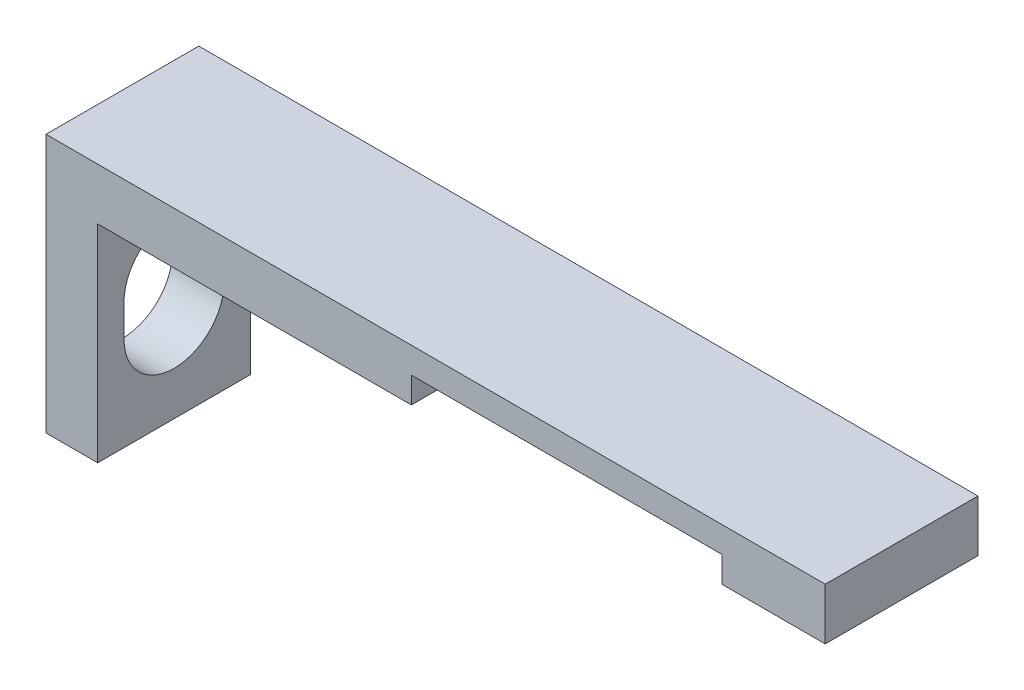
ISO-10303-21;
HEADER;
FILE_DESCRIPTION(('STEP AP214'),'2;1');
FILE_NAME('part.step','',(''),(''),'','','');
FILE_SCHEMA(('AUTOMOTIVE_DESIGN { 1 0 10303 214 1 1 1 1 }'));
ENDSEC;
DATA;
#1=APPLICATION_CONTEXT('core data for automotive mechanical design processes');
#2=APPLICATION_PROTOCOL_DEFINITION('international standard','automotive_design',2000,#1);
#3=PRODUCT_CONTEXT('',#1,'mechanical');
#4=PRODUCT('Part','Part','',(#3));
#5=PRODUCT_RELATED_PRODUCT_CATEGORY('part','',(#4));
#6=PRODUCT_DEFINITION_FORMATION('','',#4);
#7=PRODUCT_DEFINITION_CONTEXT('part definition',#1,'design');
#8=PRODUCT_DEFINITION('design','',#6,#7);
#9=PRODUCT_DEFINITION_SHAPE('','',#8);
#10=(LENGTH_UNIT() NAMED_UNIT(*) SI_UNIT(.MILLI.,.METRE.));
#11=(NAMED_UNIT(*) PLANE_ANGLE_UNIT() SI_UNIT($,.RADIAN.));
#12=(NAMED_UNIT(*) SI_UNIT($,.STERADIAN.) SOLID_ANGLE_UNIT());
#13=UNCERTAINTY_MEASURE_WITH_UNIT(LENGTH_MEASURE(1.E-05),#10,'distance_accuracy_value','');
#14=(GEOMETRIC_REPRESENTATION_CONTEXT(3) GLOBAL_UNCERTAINTY_ASSIGNED_CONTEXT((#13)) GLOBAL_UNIT_ASSIGNED_CONTEXT((#10,
#11,#12)) REPRESENTATION_CONTEXT('',''));
#15=CARTESIAN_POINT('',(0.,0.,0.));
#16=DIRECTION('',(0.,0.,1.));
#17=DIRECTION('',(1.,0.,0.));
#18=AXIS2_PLACEMENT_3D('',#15,#16,#17);
#19=CARTESIAN_POINT('',(48.2,12.8,4.725));
#20=DIRECTION('',(0.,1.,0.));
#21=DIRECTION('',(-1.,0.,0.));
#22=AXIS2_PLACEMENT_3D('',#19,#20,#21);
#23=PLANE('',#22);
#24=DIRECTION('',(1.,0.,0.));
#25=VECTOR('',#24,1.);
#26=CARTESIAN_POINT('',(48.2,12.8,-4.725));
#27=LINE('',#26,#25);
#28=CARTESIAN_POINT('',(3.2,12.8,-4.725));
#29=VERTEX_POINT('',#28);
#30=CARTESIAN_POINT('',(22.6,12.8,-4.725));
#31=VERTEX_POINT('',#30);
#32=EDGE_CURVE('E259',#29,#31,#27,.T.);
#33=ORIENTED_EDGE('',*,*,#32,.T.);
#34=DIRECTION('',(0.,0.,1.));
#35=VECTOR('',#34,1.);
#36=CARTESIAN_POINT('',(22.6,12.8,-4.725));
#37=LINE('',#36,#35);
#38=CARTESIAN_POINT('',(22.6,12.8,4.725));
#39=VERTEX_POINT('',#38);
#40=EDGE_CURVE('E206',#31,#39,#37,.T.);
#41=ORIENTED_EDGE('',*,*,#40,.T.);
#42=DIRECTION('',(1.,0.,0.));
#43=VECTOR('',#42,1.);
#44=CARTESIAN_POINT('',(48.2,12.8,4.725));
#45=LINE('',#44,#43);
#46=CARTESIAN_POINT('',(3.2,12.8,4.725));
#47=VERTEX_POINT('',#46);
#48=EDGE_CURVE('E238',#47,#39,#45,.T.);
#49=ORIENTED_EDGE('',*,*,#48,.F.);
#50=DIRECTION('',(0.,0.,-1.));
#51=VECTOR('',#50,1.);
#52=CARTESIAN_POINT('',(3.2,12.8,4.725));
#53=LINE('',#52,#51);
#54=EDGE_CURVE('E51',#47,#29,#53,.T.);
#55=ORIENTED_EDGE('',*,*,#54,.T.);
#56=EDGE_LOOP('',(#33,#41,#49,#55));
#57=FACE_BOUND('',#56,.T.);
#58=ADVANCED_FACE('F42',(#57),#23,.F.);
#59=CARTESIAN_POINT('',(3.2,0.,4.725));
#60=DIRECTION('',(0.,1.,0.));
#61=DIRECTION('',(-1.,0.,0.));
#62=AXIS2_PLACEMENT_3D('',#59,#60,#61);
#63=PLANE('',#62);
#64=DIRECTION('',(1.,0.,0.));
#65=VECTOR('',#64,1.);
#66=CARTESIAN_POINT('',(3.2,0.,-4.725));
#67=LINE('',#66,#65);
#68=CARTESIAN_POINT('',(0.,0.,-4.725));
#69=VERTEX_POINT('',#68);
#70=CARTESIAN_POINT('',(3.2,0.,-4.725));
#71=VERTEX_POINT('',#70);
#72=EDGE_CURVE('E219',#69,#71,#67,.T.);
#73=ORIENTED_EDGE('',*,*,#72,.T.);
#74=DIRECTION('',(0.,0.,-1.));
#75=VECTOR('',#74,1.);
#76=CARTESIAN_POINT('',(3.2,0.,4.725));
#77=LINE('',#76,#75);
#78=CARTESIAN_POINT('',(3.2,0.,4.725));
#79=VERTEX_POINT('',#78);
#80=EDGE_CURVE('E11',#79,#71,#77,.T.);
#81=ORIENTED_EDGE('',*,*,#80,.F.);
#82=DIRECTION('',(1.,0.,0.));
#83=VECTOR('',#82,1.);
#84=CARTESIAN_POINT('',(3.2,0.,4.725));
#85=LINE('',#84,#83);
#86=CARTESIAN_POINT('',(0.,0.,4.725));
#87=VERTEX_POINT('',#86);
#88=EDGE_CURVE('E229',#87,#79,#85,.T.);
#89=ORIENTED_EDGE('',*,*,#88,.F.);
#90=DIRECTION('',(0.,0.,-1.));
#91=VECTOR('',#90,1.);
#92=CARTESIAN_POINT('',(0.,0.,4.725));
#93=LINE('',#92,#91);
#94=EDGE_CURVE('E251',#87,#69,#93,.T.);
#95=ORIENTED_EDGE('',*,*,#94,.T.);
#96=EDGE_LOOP('',(#73,#81,#89,#95));
#97=FACE_BOUND('',#96,.T.);
#98=ADVANCED_FACE('F44',(#97),#63,.F.);
#99=CARTESIAN_POINT('',(3.2,12.8,4.725));
#100=DIRECTION('',(-1.,0.,0.));
#101=DIRECTION('',(0.,-1.,0.));
#102=AXIS2_PLACEMENT_3D('',#99,#100,#101);
#103=PLANE('',#102);
#104=DIRECTION('',(0.,1.,0.));
#105=VECTOR('',#104,1.);
#106=CARTESIAN_POINT('',(3.2,5.8,-3.1));
#107=LINE('',#106,#105);
#108=CARTESIAN_POINT('',(3.2,5.8,-3.1));
#109=VERTEX_POINT('',#108);
#110=CARTESIAN_POINT('',(3.2,7.8,-3.1));
#111=VERTEX_POINT('',#110);
#112=EDGE_CURVE('E172',#109,#111,#107,.T.);
#113=ORIENTED_EDGE('',*,*,#112,.F.);
#114=CARTESIAN_POINT('',(3.2,5.8,0.));
#115=DIRECTION('',(1.,0.,0.));
#116=DIRECTION('',(0.,1.,0.));
#117=AXIS2_PLACEMENT_3D('',#114,#115,#116);
#118=CIRCLE('',#117,3.1);
#119=CARTESIAN_POINT('',(3.2,5.8,3.1));
#120=VERTEX_POINT('',#119);
#121=EDGE_CURVE('E58',#120,#109,#118,.T.);
#122=ORIENTED_EDGE('',*,*,#121,.F.);
#123=DIRECTION('',(0.,-1.,0.));
#124=VECTOR('',#123,1.);
#125=CARTESIAN_POINT('',(3.2,5.8,3.1));
#126=LINE('',#125,#124);
#127=CARTESIAN_POINT('',(3.2,7.8,3.1));
#128=VERTEX_POINT('',#127);
#129=EDGE_CURVE('E153',#128,#120,#126,.T.);
#130=ORIENTED_EDGE('',*,*,#129,.F.);
#131=CARTESIAN_POINT('',(3.2,7.8,0.));
#132=DIRECTION('',(1.,0.,0.));
#133=DIRECTION('',(0.,1.,0.));
#134=AXIS2_PLACEMENT_3D('',#131,#132,#133);
#135=CIRCLE('',#134,3.1);
#136=EDGE_CURVE('E179',#111,#128,#135,.T.);
#137=ORIENTED_EDGE('',*,*,#136,.F.);
#138=EDGE_LOOP('',(#113,#122,#130,#137));
#139=FACE_BOUND('',#138,.T.);
#140=DIRECTION('',(0.,1.,0.));
#141=VECTOR('',#140,1.);
#142=CARTESIAN_POINT('',(3.2,12.8,-4.725));
#143=LINE('',#142,#141);
#144=EDGE_CURVE('E255',#71,#29,#143,.T.);
#145=ORIENTED_EDGE('',*,*,#144,.T.);
#146=ORIENTED_EDGE('',*,*,#54,.F.);
#147=DIRECTION('',(0.,1.,0.));
#148=VECTOR('',#147,1.);
#149=CARTESIAN_POINT('',(3.2,12.8,4.725));
#150=LINE('',#149,#148);
#151=EDGE_CURVE('E233',#79,#47,#150,.T.);
#152=ORIENTED_EDGE('',*,*,#151,.F.);
#153=ORIENTED_EDGE('',*,*,#80,.T.);
#154=EDGE_LOOP('',(#145,#146,#152,#153));
#155=FACE_BOUND('',#154,.T.);
#156=ADVANCED_FACE('F305',(#139,#155),#103,.F.);
#157=CARTESIAN_POINT('',(41.8,12.8,4.725));
#158=VERTEX_POINT('',#157);
#159=CARTESIAN_POINT('',(48.2,12.8,4.725));
#160=VERTEX_POINT('',#159);
#161=EDGE_CURVE('E237',#158,#160,#45,.T.);
#162=ORIENTED_EDGE('',*,*,#161,.F.);
#163=DIRECTION('',(0.,0.,1.));
#164=VECTOR('',#163,1.);
#165=CARTESIAN_POINT('',(41.8,12.8,-4.725));
#166=LINE('',#165,#164);
#167=CARTESIAN_POINT('',(41.8,12.8,-4.725));
#168=VERTEX_POINT('',#167);
#169=EDGE_CURVE('E223',#168,#158,#166,.T.);
#170=ORIENTED_EDGE('',*,*,#169,.F.);
#171=CARTESIAN_POINT('',(48.2,12.8,-4.725));
#172=VERTEX_POINT('',#171);
#173=EDGE_CURVE('E258',#168,#172,#27,.T.);
#174=ORIENTED_EDGE('',*,*,#173,.T.);
#175=DIRECTION('',(0.,0.,-1.));
#176=VECTOR('',#175,1.);
#177=CARTESIAN_POINT('',(48.2,12.8,4.725));
#178=LINE('',#177,#176);
#179=EDGE_CURVE('E282',#160,#172,#178,.T.);
#180=ORIENTED_EDGE('',*,*,#179,.F.);
#181=EDGE_LOOP('',(#162,#170,#174,#180));
#182=FACE_BOUND('',#181,.T.);
#183=ADVANCED_FACE('F365',(#182),#23,.F.);
#184=CARTESIAN_POINT('',(48.2,16.,4.725));
#185=DIRECTION('',(-1.,0.,0.));
#186=DIRECTION('',(0.,0.,1.));
#187=AXIS2_PLACEMENT_3D('',#184,#185,#186);
#188=PLANE('',#187);
#189=DIRECTION('',(0.,1.,0.));
#190=VECTOR('',#189,1.);
#191=CARTESIAN_POINT('',(48.2,16.,-4.725));
#192=LINE('',#191,#190);
#193=CARTESIAN_POINT('',(48.2,16.,-4.725));
#194=VERTEX_POINT('',#193);
#195=EDGE_CURVE('E263',#172,#194,#192,.T.);
#196=ORIENTED_EDGE('',*,*,#195,.T.);
#197=DIRECTION('',(0.,0.,-1.));
#198=VECTOR('',#197,1.);
#199=CARTESIAN_POINT('',(48.2,16.,4.725));
#200=LINE('',#199,#198);
#201=CARTESIAN_POINT('',(48.2,16.,4.725));
#202=VERTEX_POINT('',#201);
#203=EDGE_CURVE('E278',#202,#194,#200,.T.);
#204=ORIENTED_EDGE('',*,*,#203,.F.);
#205=DIRECTION('',(0.,1.,0.));
#206=VECTOR('',#205,1.);
#207=CARTESIAN_POINT('',(48.2,16.,4.725));
#208=LINE('',#207,#206);
#209=EDGE_CURVE('E242',#160,#202,#208,.T.);
#210=ORIENTED_EDGE('',*,*,#209,.F.);
#211=ORIENTED_EDGE('',*,*,#179,.T.);
#212=EDGE_LOOP('',(#196,#204,#210,#211));
#213=FACE_BOUND('',#212,.T.);
#214=ADVANCED_FACE('F319',(#213),#188,.F.);
#215=CARTESIAN_POINT('',(0.,16.,4.725));
#216=DIRECTION('',(0.,-1.,0.));
#217=DIRECTION('',(0.,0.,-1.));
#218=AXIS2_PLACEMENT_3D('',#215,#216,#217);
#219=PLANE('',#218);
#220=DIRECTION('',(-1.,0.,0.));
#221=VECTOR('',#220,1.);
#222=CARTESIAN_POINT('',(0.,16.,-4.725));
#223=LINE('',#222,#221);
#224=CARTESIAN_POINT('',(0.,16.,-4.725));
#225=VERTEX_POINT('',#224);
#226=EDGE_CURVE('E266',#194,#225,#223,.T.);
#227=ORIENTED_EDGE('',*,*,#226,.T.);
#228=DIRECTION('',(0.,0.,-1.));
#229=VECTOR('',#228,1.);
#230=CARTESIAN_POINT('',(0.,16.,4.725));
#231=LINE('',#230,#229);
#232=CARTESIAN_POINT('',(0.,16.,4.725));
#233=VERTEX_POINT('',#232);
#234=EDGE_CURVE('E274',#233,#225,#231,.T.);
#235=ORIENTED_EDGE('',*,*,#234,.F.);
#236=DIRECTION('',(-1.,0.,0.));
#237=VECTOR('',#236,1.);
#238=CARTESIAN_POINT('',(0.,16.,4.725));
#239=LINE('',#238,#237);
#240=EDGE_CURVE('E245',#202,#233,#239,.T.);
#241=ORIENTED_EDGE('',*,*,#240,.F.);
#242=ORIENTED_EDGE('',*,*,#203,.T.);
#243=EDGE_LOOP('',(#227,#235,#241,#242));
#244=FACE_BOUND('',#243,.T.);
#245=ADVANCED_FACE('F315',(#244),#219,.F.);
#246=CARTESIAN_POINT('',(0.,0.,4.725));
#247=DIRECTION('',(1.,0.,0.));
#248=DIRECTION('',(0.,0.,-1.));
#249=AXIS2_PLACEMENT_3D('',#246,#247,#248);
#250=PLANE('',#249);
#251=DIRECTION('',(0.,1.,0.));
#252=VECTOR('',#251,1.);
#253=CARTESIAN_POINT('',(0.,5.8,3.1));
#254=LINE('',#253,#252);
#255=CARTESIAN_POINT('',(0.,5.8,3.1));
#256=VERTEX_POINT('',#255);
#257=CARTESIAN_POINT('',(0.,7.8,3.1));
#258=VERTEX_POINT('',#257);
#259=EDGE_CURVE('E166',#256,#258,#254,.T.);
#260=ORIENTED_EDGE('',*,*,#259,.F.);
#261=CARTESIAN_POINT('',(0.,5.8,0.));
#262=DIRECTION('',(1.,0.,0.));
#263=DIRECTION('',(0.,0.,-1.));
#264=AXIS2_PLACEMENT_3D('',#261,#262,#263);
#265=CIRCLE('',#264,3.1);
#266=CARTESIAN_POINT('',(0.,5.8,-3.1));
#267=VERTEX_POINT('',#266);
#268=EDGE_CURVE('E146',#267,#256,#265,.F.);
#269=ORIENTED_EDGE('',*,*,#268,.F.);
#270=DIRECTION('',(0.,-1.,0.));
#271=VECTOR('',#270,1.);
#272=CARTESIAN_POINT('',(0.,5.8,-3.1));
#273=LINE('',#272,#271);
#274=CARTESIAN_POINT('',(0.,7.8,-3.1));
#275=VERTEX_POINT('',#274);
#276=EDGE_CURVE('E156',#275,#267,#273,.T.);
#277=ORIENTED_EDGE('',*,*,#276,.F.);
#278=CARTESIAN_POINT('',(0.,7.8,0.));
#279=DIRECTION('',(1.,0.,0.));
#280=DIRECTION('',(0.,0.,-1.));
#281=AXIS2_PLACEMENT_3D('',#278,#279,#280);
#282=CIRCLE('',#281,3.1);
#283=EDGE_CURVE('E66',#258,#275,#282,.F.);
#284=ORIENTED_EDGE('',*,*,#283,.F.);
#285=EDGE_LOOP('',(#260,#269,#277,#284));
#286=FACE_BOUND('',#285,.T.);
#287=DIRECTION('',(0.,-1.,0.));
#288=VECTOR('',#287,1.);
#289=CARTESIAN_POINT('',(0.,0.,-4.725));
#290=LINE('',#289,#288);
#291=EDGE_CURVE('E234',#225,#69,#290,.T.);
#292=ORIENTED_EDGE('',*,*,#291,.T.);
#293=ORIENTED_EDGE('',*,*,#94,.F.);
#294=DIRECTION('',(0.,-1.,0.));
#295=VECTOR('',#294,1.);
#296=CARTESIAN_POINT('',(0.,0.,4.725));
#297=LINE('',#296,#295);
#298=EDGE_CURVE('E248',#233,#87,#297,.T.);
#299=ORIENTED_EDGE('',*,*,#298,.F.);
#300=ORIENTED_EDGE('',*,*,#234,.T.);
#301=EDGE_LOOP('',(#292,#293,#299,#300));
#302=FACE_BOUND('',#301,.T.);
#303=ADVANCED_FACE('F163',(#286,#302),#250,.F.);
#304=CARTESIAN_POINT('',(0.,0.,4.725));
#305=DIRECTION('',(0.,0.,-1.));
#306=DIRECTION('',(-1.,0.,0.));
#307=AXIS2_PLACEMENT_3D('',#304,#305,#306);
#308=PLANE('',#307);
#309=ORIENTED_EDGE('',*,*,#48,.T.);
#310=DIRECTION('',(0.,-1.,0.));
#311=VECTOR('',#310,1.);
#312=CARTESIAN_POINT('',(22.6,12.8,4.725));
#313=LINE('',#312,#311);
#314=CARTESIAN_POINT('',(22.6,14.4,4.725));
#315=VERTEX_POINT('',#314);
#316=EDGE_CURVE('E160',#315,#39,#313,.T.);
#317=ORIENTED_EDGE('',*,*,#316,.F.);
#318=DIRECTION('',(-1.,0.,0.));
#319=VECTOR('',#318,1.);
#320=CARTESIAN_POINT('',(22.6,14.4,4.725));
#321=LINE('',#320,#319);
#322=CARTESIAN_POINT('',(41.8,14.4,4.725));
#323=VERTEX_POINT('',#322);
#324=EDGE_CURVE('E198',#323,#315,#321,.T.);
#325=ORIENTED_EDGE('',*,*,#324,.F.);
#326=DIRECTION('',(0.,1.,0.));
#327=VECTOR('',#326,1.);
#328=CARTESIAN_POINT('',(41.8,12.8,4.725));
#329=LINE('',#328,#327);
#330=EDGE_CURVE('E209',#158,#323,#329,.T.);
#331=ORIENTED_EDGE('',*,*,#330,.F.);
#332=ORIENTED_EDGE('',*,*,#161,.T.);
#333=ORIENTED_EDGE('',*,*,#209,.T.);
#334=ORIENTED_EDGE('',*,*,#240,.T.);
#335=ORIENTED_EDGE('',*,*,#298,.T.);
#336=ORIENTED_EDGE('',*,*,#88,.T.);
#337=ORIENTED_EDGE('',*,*,#151,.T.);
#338=EDGE_LOOP('',(#309,#317,#325,#331,#332,#333,#334,#335,#336,#337));
#339=FACE_BOUND('',#338,.T.);
#340=ADVANCED_FACE('F301',(#339),#308,.F.);
#341=CARTESIAN_POINT('',(0.,0.,-4.725));
#342=DIRECTION('',(0.,0.,-1.));
#343=DIRECTION('',(-1.,0.,0.));
#344=AXIS2_PLACEMENT_3D('',#341,#342,#343);
#345=PLANE('',#344);
#346=DIRECTION('',(0.,-1.,0.));
#347=VECTOR('',#346,1.);
#348=CARTESIAN_POINT('',(22.6,12.8,-4.725));
#349=LINE('',#348,#347);
#350=CARTESIAN_POINT('',(22.6,14.4,-4.725));
#351=VERTEX_POINT('',#350);
#352=EDGE_CURVE('E193',#351,#31,#349,.T.);
#353=ORIENTED_EDGE('',*,*,#352,.T.);
#354=ORIENTED_EDGE('',*,*,#32,.F.);
#355=ORIENTED_EDGE('',*,*,#144,.F.);
#356=ORIENTED_EDGE('',*,*,#72,.F.);
#357=ORIENTED_EDGE('',*,*,#291,.F.);
#358=ORIENTED_EDGE('',*,*,#226,.F.);
#359=ORIENTED_EDGE('',*,*,#195,.F.);
#360=ORIENTED_EDGE('',*,*,#173,.F.);
#361=DIRECTION('',(0.,1.,0.));
#362=VECTOR('',#361,1.);
#363=CARTESIAN_POINT('',(41.8,12.8,-4.725));
#364=LINE('',#363,#362);
#365=CARTESIAN_POINT('',(41.8,14.4,-4.725));
#366=VERTEX_POINT('',#365);
#367=EDGE_CURVE('E197',#168,#366,#364,.T.);
#368=ORIENTED_EDGE('',*,*,#367,.T.);
#369=DIRECTION('',(-1.,0.,0.));
#370=VECTOR('',#369,1.);
#371=CARTESIAN_POINT('',(22.6,14.4,-4.725));
#372=LINE('',#371,#370);
#373=EDGE_CURVE('E202',#366,#351,#372,.T.);
#374=ORIENTED_EDGE('',*,*,#373,.T.);
#375=EDGE_LOOP('',(#353,#354,#355,#356,#357,#358,#359,#360,#368,#374));
#376=FACE_BOUND('',#375,.T.);
#377=ADVANCED_FACE('F294',(#376),#345,.T.);
#378=CARTESIAN_POINT('',(22.6,12.8,-4.725));
#379=DIRECTION('',(-1.,0.,0.));
#380=DIRECTION('',(0.,0.,1.));
#381=AXIS2_PLACEMENT_3D('',#378,#379,#380);
#382=PLANE('',#381);
#383=ORIENTED_EDGE('',*,*,#316,.T.);
#384=ORIENTED_EDGE('',*,*,#40,.F.);
#385=ORIENTED_EDGE('',*,*,#352,.F.);
#386=DIRECTION('',(0.,0.,1.));
#387=VECTOR('',#386,1.);
#388=CARTESIAN_POINT('',(22.6,14.4,-4.725));
#389=LINE('',#388,#387);
#390=EDGE_CURVE('E216',#351,#315,#389,.T.);
#391=ORIENTED_EDGE('',*,*,#390,.T.);
#392=EDGE_LOOP('',(#383,#384,#385,#391));
#393=FACE_BOUND('',#392,.T.);
#394=ADVANCED_FACE('F298',(#393),#382,.F.);
#395=CARTESIAN_POINT('',(22.6,14.4,-4.725));
#396=DIRECTION('',(0.,1.,0.));
#397=DIRECTION('',(0.,0.,1.));
#398=AXIS2_PLACEMENT_3D('',#395,#396,#397);
#399=PLANE('',#398);
#400=ORIENTED_EDGE('',*,*,#324,.T.);
#401=ORIENTED_EDGE('',*,*,#390,.F.);
#402=ORIENTED_EDGE('',*,*,#373,.F.);
#403=DIRECTION('',(0.,0.,1.));
#404=VECTOR('',#403,1.);
#405=CARTESIAN_POINT('',(41.8,14.4,-4.725));
#406=LINE('',#405,#404);
#407=EDGE_CURVE('E220',#366,#323,#406,.T.);
#408=ORIENTED_EDGE('',*,*,#407,.T.);
#409=EDGE_LOOP('',(#400,#401,#402,#408));
#410=FACE_BOUND('',#409,.T.);
#411=ADVANCED_FACE('F432',(#410),#399,.F.);
#412=CARTESIAN_POINT('',(41.8,12.8,-4.725));
#413=DIRECTION('',(1.,0.,0.));
#414=DIRECTION('',(0.,0.,-1.));
#415=AXIS2_PLACEMENT_3D('',#412,#413,#414);
#416=PLANE('',#415);
#417=ORIENTED_EDGE('',*,*,#330,.T.);
#418=ORIENTED_EDGE('',*,*,#407,.F.);
#419=ORIENTED_EDGE('',*,*,#367,.F.);
#420=ORIENTED_EDGE('',*,*,#169,.T.);
#421=EDGE_LOOP('',(#417,#418,#419,#420));
#422=FACE_BOUND('',#421,.T.);
#423=ADVANCED_FACE('F441',(#422),#416,.F.);
#424=CARTESIAN_POINT('',(-0.00100000000000057,5.8,0.));
#425=DIRECTION('',(1.,0.,0.));
#426=DIRECTION('',(0.,1.,0.));
#427=AXIS2_PLACEMENT_3D('',#424,#425,#426);
#428=CYLINDRICAL_SURFACE('',#427,3.1);
#429=ORIENTED_EDGE('',*,*,#268,.T.);
#430=DIRECTION('',(1.,0.,0.));
#431=VECTOR('',#430,1.);
#432=CARTESIAN_POINT('',(-0.00100000000000057,5.8,3.1));
#433=LINE('',#432,#431);
#434=EDGE_CURVE('E161',#256,#120,#433,.T.);
#435=ORIENTED_EDGE('',*,*,#434,.T.);
#436=ORIENTED_EDGE('',*,*,#121,.T.);
#437=DIRECTION('',(1.,0.,0.));
#438=VECTOR('',#437,1.);
#439=CARTESIAN_POINT('',(-0.00100000000000057,5.8,-3.1));
#440=LINE('',#439,#438);
#441=EDGE_CURVE('E142',#267,#109,#440,.T.);
#442=ORIENTED_EDGE('',*,*,#441,.F.);
#443=EDGE_LOOP('',(#429,#435,#436,#442));
#444=FACE_BOUND('',#443,.T.);
#445=ADVANCED_FACE('F144',(#444),#428,.F.);
#446=CARTESIAN_POINT('',(-0.00100000000000057,5.8,3.1));
#447=DIRECTION('',(0.,0.,1.));
#448=DIRECTION('',(0.,-1.,0.));
#449=AXIS2_PLACEMENT_3D('',#446,#447,#448);
#450=PLANE('',#449);
#451=ORIENTED_EDGE('',*,*,#259,.T.);
#452=DIRECTION('',(1.,0.,0.));
#453=VECTOR('',#452,1.);
#454=CARTESIAN_POINT('',(-0.00100000000000057,7.8,3.1));
#455=LINE('',#454,#453);
#456=EDGE_CURVE('E188',#258,#128,#455,.T.);
#457=ORIENTED_EDGE('',*,*,#456,.T.);
#458=ORIENTED_EDGE('',*,*,#129,.T.);
#459=ORIENTED_EDGE('',*,*,#434,.F.);
#460=EDGE_LOOP('',(#451,#457,#458,#459));
#461=FACE_BOUND('',#460,.T.);
#462=ADVANCED_FACE('F459',(#461),#450,.F.);
#463=CARTESIAN_POINT('',(-0.00100000000000057,7.8,0.));
#464=DIRECTION('',(1.,0.,0.));
#465=DIRECTION('',(0.,1.,0.));
#466=AXIS2_PLACEMENT_3D('',#463,#464,#465);
#467=CYLINDRICAL_SURFACE('',#466,3.1);
#468=ORIENTED_EDGE('',*,*,#283,.T.);
#469=DIRECTION('',(1.,0.,0.));
#470=VECTOR('',#469,1.);
#471=CARTESIAN_POINT('',(-0.00100000000000057,7.8,-3.1));
#472=LINE('',#471,#470);
#473=EDGE_CURVE('E152',#275,#111,#472,.T.);
#474=ORIENTED_EDGE('',*,*,#473,.T.);
#475=ORIENTED_EDGE('',*,*,#136,.T.);
#476=ORIENTED_EDGE('',*,*,#456,.F.);
#477=EDGE_LOOP('',(#468,#474,#475,#476));
#478=FACE_BOUND('',#477,.T.);
#479=ADVANCED_FACE('F468',(#478),#467,.F.);
#480=CARTESIAN_POINT('',(-0.00100000000000057,5.8,-3.1));
#481=DIRECTION('',(0.,0.,-1.));
#482=DIRECTION('',(0.,1.,0.));
#483=AXIS2_PLACEMENT_3D('',#480,#481,#482);
#484=PLANE('',#483);
#485=ORIENTED_EDGE('',*,*,#276,.T.);
#486=ORIENTED_EDGE('',*,*,#441,.T.);
#487=ORIENTED_EDGE('',*,*,#112,.T.);
#488=ORIENTED_EDGE('',*,*,#473,.F.);
#489=EDGE_LOOP('',(#485,#486,#487,#488));
#490=FACE_BOUND('',#489,.T.);
#491=ADVANCED_FACE('F157',(#490),#484,.F.);
#492=CLOSED_SHELL('',(#58,#98,#156,#183,#214,#245,#303,#340,#377,#394,#411,#423,#445,#462,#479,#491));
#493=MANIFOLD_SOLID_BREP('B2',#492);
#494=ADVANCED_BREP_SHAPE_REPRESENTATION('',(#18,#493),#14);
#495=SHAPE_DEFINITION_REPRESENTATION(#9,#494);
ENDSEC;
END-ISO-10303-21;
